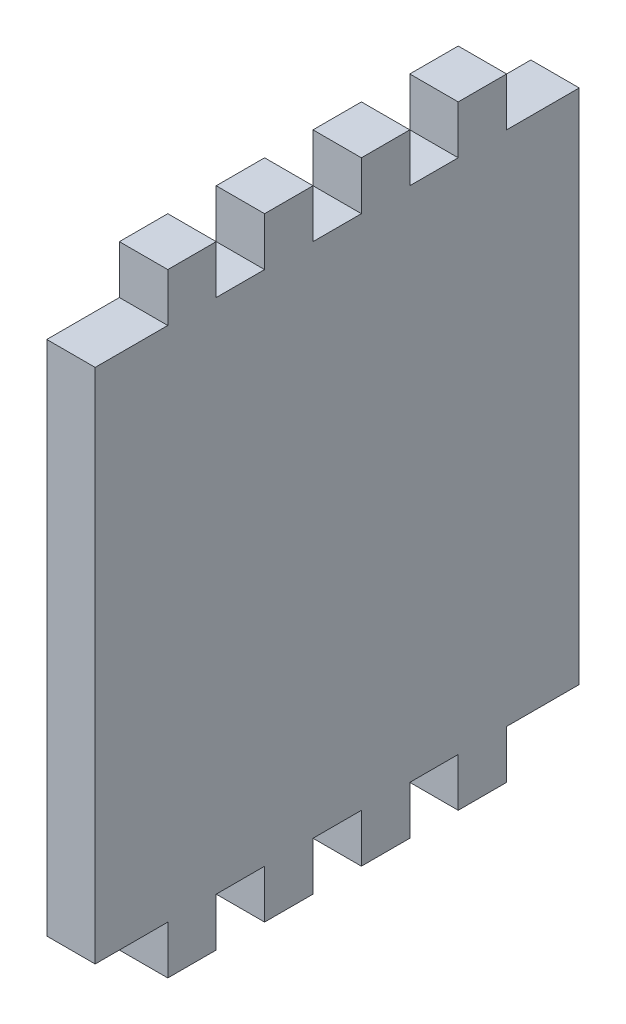
ISO-10303-21;
HEADER;
FILE_DESCRIPTION(('STEP AP214'),'2;1');
FILE_NAME('part.step','',(''),(''),'','','');
FILE_SCHEMA(('AUTOMOTIVE_DESIGN { 1 0 10303 214 1 1 1 1 }'));
ENDSEC;
DATA;
#1=APPLICATION_CONTEXT('core data for automotive mechanical design processes');
#2=APPLICATION_PROTOCOL_DEFINITION('international standard','automotive_design',2000,#1);
#3=PRODUCT_CONTEXT('',#1,'mechanical');
#4=PRODUCT('Part','Part','',(#3));
#5=PRODUCT_RELATED_PRODUCT_CATEGORY('part','',(#4));
#6=PRODUCT_DEFINITION_FORMATION('','',#4);
#7=PRODUCT_DEFINITION_CONTEXT('part definition',#1,'design');
#8=PRODUCT_DEFINITION('design','',#6,#7);
#9=PRODUCT_DEFINITION_SHAPE('','',#8);
#10=(LENGTH_UNIT() NAMED_UNIT(*) SI_UNIT(.MILLI.,.METRE.));
#11=(NAMED_UNIT(*) PLANE_ANGLE_UNIT() SI_UNIT($,.RADIAN.));
#12=(NAMED_UNIT(*) SI_UNIT($,.STERADIAN.) SOLID_ANGLE_UNIT());
#13=UNCERTAINTY_MEASURE_WITH_UNIT(LENGTH_MEASURE(1.E-05),#10,'distance_accuracy_value','');
#14=(GEOMETRIC_REPRESENTATION_CONTEXT(3) GLOBAL_UNCERTAINTY_ASSIGNED_CONTEXT((#13)) GLOBAL_UNIT_ASSIGNED_CONTEXT((#10,
#11,#12)) REPRESENTATION_CONTEXT('',''));
#15=CARTESIAN_POINT('',(0.,0.,0.));
#16=DIRECTION('',(0.,0.,1.));
#17=DIRECTION('',(1.,0.,0.));
#18=AXIS2_PLACEMENT_3D('',#15,#16,#17);
#19=CARTESIAN_POINT('',(5.08,-40.1420998104265,20.2236966824645));
#20=DIRECTION('',(0.,1.,0.));
#21=DIRECTION('',(0.,0.,1.));
#22=AXIS2_PLACEMENT_3D('',#19,#20,#21);
#23=PLANE('',#22);
#24=DIRECTION('',(0.,0.,-1.));
#25=VECTOR('',#24,1.);
#26=CARTESIAN_POINT('',(5.08,-40.1420998104265,20.2236966824645));
#27=LINE('',#26,#25);
#28=CARTESIAN_POINT('',(5.08,-40.1420998104265,-12.7963033175355));
#29=VERTEX_POINT('',#28);
#30=CARTESIAN_POINT('',(5.08,-40.1420998104265,-17.8763033175355));
#31=VERTEX_POINT('',#30);
#32=EDGE_CURVE('E48',#29,#31,#27,.T.);
#33=ORIENTED_EDGE('',*,*,#32,.F.);
#34=DIRECTION('',(1.,0.,0.));
#35=VECTOR('',#34,1.);
#36=CARTESIAN_POINT('',(0.,-40.1420998104265,-12.7963033175355));
#37=LINE('',#36,#35);
#38=CARTESIAN_POINT('',(0.,-40.1420998104265,-12.7963033175355));
#39=VERTEX_POINT('',#38);
#40=EDGE_CURVE('E300',#39,#29,#37,.T.);
#41=ORIENTED_EDGE('',*,*,#40,.F.);
#42=DIRECTION('',(0.,0.,-1.));
#43=VECTOR('',#42,1.);
#44=CARTESIAN_POINT('',(0.,-40.1420998104265,20.2236966824645));
#45=LINE('',#44,#43);
#46=CARTESIAN_POINT('',(0.,-40.1420998104265,-17.8763033175355));
#47=VERTEX_POINT('',#46);
#48=EDGE_CURVE('E520',#39,#47,#45,.T.);
#49=ORIENTED_EDGE('',*,*,#48,.T.);
#50=DIRECTION('',(1.,0.,0.));
#51=VECTOR('',#50,1.);
#52=CARTESIAN_POINT('',(0.,-40.1420998104266,-17.8763033175355));
#53=LINE('',#52,#51);
#54=EDGE_CURVE('E315',#47,#31,#53,.T.);
#55=ORIENTED_EDGE('',*,*,#54,.T.);
#56=EDGE_LOOP('',(#33,#41,#49,#55));
#57=FACE_BOUND('',#56,.T.);
#58=ADVANCED_FACE('F33',(#57),#23,.F.);
#59=CARTESIAN_POINT('',(5.08,-40.1420998104265,-22.9563033175355));
#60=VERTEX_POINT('',#59);
#61=CARTESIAN_POINT('',(5.08,-40.1420998104265,-30.5763033175355));
#62=VERTEX_POINT('',#61);
#63=EDGE_CURVE('E496',#60,#62,#27,.T.);
#64=ORIENTED_EDGE('',*,*,#63,.F.);
#65=DIRECTION('',(1.,0.,0.));
#66=VECTOR('',#65,1.);
#67=CARTESIAN_POINT('',(0.,-40.1420998104266,-22.9563033175355));
#68=LINE('',#67,#66);
#69=CARTESIAN_POINT('',(0.,-40.1420998104266,-22.9563033175355));
#70=VERTEX_POINT('',#69);
#71=EDGE_CURVE('E323',#70,#60,#68,.T.);
#72=ORIENTED_EDGE('',*,*,#71,.F.);
#73=CARTESIAN_POINT('',(0.,-40.1420998104265,-30.5763033175355));
#74=VERTEX_POINT('',#73);
#75=EDGE_CURVE('E515',#70,#74,#45,.T.);
#76=ORIENTED_EDGE('',*,*,#75,.T.);
#77=DIRECTION('',(-1.,0.,0.));
#78=VECTOR('',#77,1.);
#79=CARTESIAN_POINT('',(5.08,-40.1420998104265,-30.5763033175355));
#80=LINE('',#79,#78);
#81=EDGE_CURVE('E41',#62,#74,#80,.T.);
#82=ORIENTED_EDGE('',*,*,#81,.F.);
#83=EDGE_LOOP('',(#64,#72,#76,#82));
#84=FACE_BOUND('',#83,.T.);
#85=ADVANCED_FACE('F627',(#84),#23,.F.);
#86=CARTESIAN_POINT('',(5.08,-40.1420998104265,7.5236966824645));
#87=VERTEX_POINT('',#86);
#88=CARTESIAN_POINT('',(5.08,-40.1420998104265,2.4436966824645));
#89=VERTEX_POINT('',#88);
#90=EDGE_CURVE('E502',#87,#89,#27,.T.);
#91=ORIENTED_EDGE('',*,*,#90,.F.);
#92=DIRECTION('',(1.,0.,0.));
#93=VECTOR('',#92,1.);
#94=CARTESIAN_POINT('',(0.,-40.1420998104265,7.5236966824645));
#95=LINE('',#94,#93);
#96=CARTESIAN_POINT('',(0.,-40.1420998104265,7.5236966824645));
#97=VERTEX_POINT('',#96);
#98=EDGE_CURVE('E342',#97,#87,#95,.T.);
#99=ORIENTED_EDGE('',*,*,#98,.F.);
#100=CARTESIAN_POINT('',(0.,-40.1420998104265,2.4436966824645));
#101=VERTEX_POINT('',#100);
#102=EDGE_CURVE('E519',#97,#101,#45,.T.);
#103=ORIENTED_EDGE('',*,*,#102,.T.);
#104=DIRECTION('',(1.,0.,0.));
#105=VECTOR('',#104,1.);
#106=CARTESIAN_POINT('',(0.,-40.1420998104265,2.4436966824645));
#107=LINE('',#106,#105);
#108=EDGE_CURVE('E381',#101,#89,#107,.T.);
#109=ORIENTED_EDGE('',*,*,#108,.T.);
#110=EDGE_LOOP('',(#91,#99,#103,#109));
#111=FACE_BOUND('',#110,.T.);
#112=ADVANCED_FACE('F612',(#111),#23,.F.);
#113=CARTESIAN_POINT('',(0.,-40.1420998104265,-2.6363033175355));
#114=VERTEX_POINT('',#113);
#115=CARTESIAN_POINT('',(0.,-40.1420998104265,-7.71630331753551));
#116=VERTEX_POINT('',#115);
#117=EDGE_CURVE('E521',#114,#116,#45,.T.);
#118=ORIENTED_EDGE('',*,*,#117,.T.);
#119=DIRECTION('',(1.,0.,0.));
#120=VECTOR('',#119,1.);
#121=CARTESIAN_POINT('',(0.,-40.1420998104265,-7.71630331753551));
#122=LINE('',#121,#120);
#123=CARTESIAN_POINT('',(5.08,-40.1420998104265,-7.71630331753551));
#124=VERTEX_POINT('',#123);
#125=EDGE_CURVE('E56',#116,#124,#122,.T.);
#126=ORIENTED_EDGE('',*,*,#125,.T.);
#127=CARTESIAN_POINT('',(5.08,-40.1420998104265,-2.6363033175355));
#128=VERTEX_POINT('',#127);
#129=EDGE_CURVE('E503',#128,#124,#27,.T.);
#130=ORIENTED_EDGE('',*,*,#129,.F.);
#131=DIRECTION('',(1.,0.,0.));
#132=VECTOR('',#131,1.);
#133=CARTESIAN_POINT('',(0.,-40.1420998104265,-2.6363033175355));
#134=LINE('',#133,#132);
#135=EDGE_CURVE('E368',#114,#128,#134,.T.);
#136=ORIENTED_EDGE('',*,*,#135,.F.);
#137=EDGE_LOOP('',(#118,#126,#130,#136));
#138=FACE_BOUND('',#137,.T.);
#139=ADVANCED_FACE('F629',(#138),#23,.F.);
#140=CARTESIAN_POINT('',(5.08,14.0843601895735,20.2236966824645));
#141=DIRECTION('',(0.,-1.,0.));
#142=DIRECTION('',(0.,0.,-1.));
#143=AXIS2_PLACEMENT_3D('',#140,#141,#142);
#144=PLANE('',#143);
#145=DIRECTION('',(0.,0.,1.));
#146=VECTOR('',#145,1.);
#147=CARTESIAN_POINT('',(5.08,14.0843601895735,20.2236966824645));
#148=LINE('',#147,#146);
#149=CARTESIAN_POINT('',(5.08,14.0843601895735,2.44369668246448));
#150=VERTEX_POINT('',#149);
#151=CARTESIAN_POINT('',(5.08,14.0843601895735,7.52369668246448));
#152=VERTEX_POINT('',#151);
#153=EDGE_CURVE('E511',#150,#152,#148,.T.);
#154=ORIENTED_EDGE('',*,*,#153,.F.);
#155=DIRECTION('',(1.,0.,0.));
#156=VECTOR('',#155,1.);
#157=CARTESIAN_POINT('',(0.,14.0843601895735,2.44369668246448));
#158=LINE('',#157,#156);
#159=CARTESIAN_POINT('',(0.,14.0843601895735,2.44369668246448));
#160=VERTEX_POINT('',#159);
#161=EDGE_CURVE('E403',#160,#150,#158,.T.);
#162=ORIENTED_EDGE('',*,*,#161,.F.);
#163=DIRECTION('',(0.,0.,1.));
#164=VECTOR('',#163,1.);
#165=CARTESIAN_POINT('',(0.,14.0843601895735,20.2236966824645));
#166=LINE('',#165,#164);
#167=CARTESIAN_POINT('',(0.,14.0843601895735,7.52369668246448));
#168=VERTEX_POINT('',#167);
#169=EDGE_CURVE('E526',#160,#168,#166,.T.);
#170=ORIENTED_EDGE('',*,*,#169,.T.);
#171=DIRECTION('',(1.,0.,0.));
#172=VECTOR('',#171,1.);
#173=CARTESIAN_POINT('',(0.,14.0843601895735,7.52369668246448));
#174=LINE('',#173,#172);
#175=EDGE_CURVE('E422',#168,#152,#174,.T.);
#176=ORIENTED_EDGE('',*,*,#175,.T.);
#177=EDGE_LOOP('',(#154,#162,#170,#176));
#178=FACE_BOUND('',#177,.T.);
#179=ADVANCED_FACE('F576',(#178),#144,.F.);
#180=CARTESIAN_POINT('',(5.08,14.0843601895735,12.6036966824645));
#181=VERTEX_POINT('',#180);
#182=CARTESIAN_POINT('',(5.08,14.0843601895735,20.2236966824645));
#183=VERTEX_POINT('',#182);
#184=EDGE_CURVE('E505',#181,#183,#148,.T.);
#185=ORIENTED_EDGE('',*,*,#184,.F.);
#186=DIRECTION('',(1.,0.,0.));
#187=VECTOR('',#186,1.);
#188=CARTESIAN_POINT('',(0.,14.0843601895735,12.6036966824645));
#189=LINE('',#188,#187);
#190=CARTESIAN_POINT('',(0.,14.0843601895735,12.6036966824645));
#191=VERTEX_POINT('',#190);
#192=EDGE_CURVE('E430',#191,#181,#189,.T.);
#193=ORIENTED_EDGE('',*,*,#192,.F.);
#194=CARTESIAN_POINT('',(0.,14.0843601895735,20.2236966824645));
#195=VERTEX_POINT('',#194);
#196=EDGE_CURVE('E523',#191,#195,#166,.T.);
#197=ORIENTED_EDGE('',*,*,#196,.T.);
#198=DIRECTION('',(-1.,0.,0.));
#199=VECTOR('',#198,1.);
#200=CARTESIAN_POINT('',(5.08,14.0843601895735,20.2236966824645));
#201=LINE('',#200,#199);
#202=EDGE_CURVE('E509',#183,#195,#201,.T.);
#203=ORIENTED_EDGE('',*,*,#202,.F.);
#204=EDGE_LOOP('',(#185,#193,#197,#203));
#205=FACE_BOUND('',#204,.T.);
#206=ADVANCED_FACE('F592',(#205),#144,.F.);
#207=CARTESIAN_POINT('',(5.08,14.0843601895735,-17.8763033175355));
#208=VERTEX_POINT('',#207);
#209=CARTESIAN_POINT('',(5.08,14.0843601895735,-12.7963033175355));
#210=VERTEX_POINT('',#209);
#211=EDGE_CURVE('E510',#208,#210,#148,.T.);
#212=ORIENTED_EDGE('',*,*,#211,.F.);
#213=DIRECTION('',(1.,0.,0.));
#214=VECTOR('',#213,1.);
#215=CARTESIAN_POINT('',(0.,14.0843601895735,-17.8763033175355));
#216=LINE('',#215,#214);
#217=CARTESIAN_POINT('',(0.,14.0843601895735,-17.8763033175355));
#218=VERTEX_POINT('',#217);
#219=EDGE_CURVE('E450',#218,#208,#216,.T.);
#220=ORIENTED_EDGE('',*,*,#219,.F.);
#221=CARTESIAN_POINT('',(0.,14.0843601895735,-12.7963033175355));
#222=VERTEX_POINT('',#221);
#223=EDGE_CURVE('E525',#218,#222,#166,.T.);
#224=ORIENTED_EDGE('',*,*,#223,.T.);
#225=DIRECTION('',(1.,0.,0.));
#226=VECTOR('',#225,1.);
#227=CARTESIAN_POINT('',(0.,14.0843601895735,-12.7963033175355));
#228=LINE('',#227,#226);
#229=EDGE_CURVE('E489',#222,#210,#228,.T.);
#230=ORIENTED_EDGE('',*,*,#229,.T.);
#231=EDGE_LOOP('',(#212,#220,#224,#230));
#232=FACE_BOUND('',#231,.T.);
#233=ADVANCED_FACE('F569',(#232),#144,.F.);
#234=CARTESIAN_POINT('',(0.,14.0843601895735,-7.71630331753552));
#235=VERTEX_POINT('',#234);
#236=CARTESIAN_POINT('',(0.,14.0843601895735,-2.63630331753552));
#237=VERTEX_POINT('',#236);
#238=EDGE_CURVE('E527',#235,#237,#166,.T.);
#239=ORIENTED_EDGE('',*,*,#238,.T.);
#240=DIRECTION('',(1.,0.,0.));
#241=VECTOR('',#240,1.);
#242=CARTESIAN_POINT('',(0.,14.0843601895735,-2.63630331753552));
#243=LINE('',#242,#241);
#244=CARTESIAN_POINT('',(5.08,14.0843601895735,-2.63630331753552));
#245=VERTEX_POINT('',#244);
#246=EDGE_CURVE('E395',#237,#245,#243,.T.);
#247=ORIENTED_EDGE('',*,*,#246,.T.);
#248=CARTESIAN_POINT('',(5.08,14.0843601895735,-7.71630331753552));
#249=VERTEX_POINT('',#248);
#250=EDGE_CURVE('E512',#249,#245,#148,.T.);
#251=ORIENTED_EDGE('',*,*,#250,.F.);
#252=DIRECTION('',(1.,0.,0.));
#253=VECTOR('',#252,1.);
#254=CARTESIAN_POINT('',(0.,14.0843601895735,-7.71630331753552));
#255=LINE('',#254,#253);
#256=EDGE_CURVE('E476',#235,#249,#255,.T.);
#257=ORIENTED_EDGE('',*,*,#256,.F.);
#258=EDGE_LOOP('',(#239,#247,#251,#257));
#259=FACE_BOUND('',#258,.T.);
#260=ADVANCED_FACE('F661',(#259),#144,.F.);
#261=CARTESIAN_POINT('',(5.08,14.0843601895735,20.2236966824645));
#262=DIRECTION('',(0.,0.,-1.));
#263=DIRECTION('',(0.,1.,0.));
#264=AXIS2_PLACEMENT_3D('',#261,#262,#263);
#265=PLANE('',#264);
#266=DIRECTION('',(0.,-1.,0.));
#267=VECTOR('',#266,1.);
#268=CARTESIAN_POINT('',(0.,14.0843601895735,20.2236966824645));
#269=LINE('',#268,#267);
#270=CARTESIAN_POINT('',(0.,-40.1420998104265,20.2236966824645));
#271=VERTEX_POINT('',#270);
#272=EDGE_CURVE('E486',#195,#271,#269,.T.);
#273=ORIENTED_EDGE('',*,*,#272,.T.);
#274=DIRECTION('',(-1.,0.,0.));
#275=VECTOR('',#274,1.);
#276=CARTESIAN_POINT('',(5.08,-40.1420998104265,20.2236966824645));
#277=LINE('',#276,#275);
#278=CARTESIAN_POINT('',(5.08,-40.1420998104265,20.2236966824645));
#279=VERTEX_POINT('',#278);
#280=EDGE_CURVE('E11',#279,#271,#277,.T.);
#281=ORIENTED_EDGE('',*,*,#280,.F.);
#282=DIRECTION('',(0.,-1.,0.));
#283=VECTOR('',#282,1.);
#284=CARTESIAN_POINT('',(5.08,14.0843601895735,20.2236966824645));
#285=LINE('',#284,#283);
#286=EDGE_CURVE('E493',#183,#279,#285,.T.);
#287=ORIENTED_EDGE('',*,*,#286,.F.);
#288=ORIENTED_EDGE('',*,*,#202,.T.);
#289=EDGE_LOOP('',(#273,#281,#287,#288));
#290=FACE_BOUND('',#289,.T.);
#291=ADVANCED_FACE('F35',(#290),#265,.F.);
#292=CARTESIAN_POINT('',(0.,-40.1420998104265,12.6036966824645));
#293=VERTEX_POINT('',#292);
#294=EDGE_CURVE('E516',#271,#293,#45,.T.);
#295=ORIENTED_EDGE('',*,*,#294,.T.);
#296=DIRECTION('',(1.,0.,0.));
#297=VECTOR('',#296,1.);
#298=CARTESIAN_POINT('',(0.,-40.1420998104265,12.6036966824645));
#299=LINE('',#298,#297);
#300=CARTESIAN_POINT('',(5.08,-40.1420998104265,12.6036966824645));
#301=VERTEX_POINT('',#300);
#302=EDGE_CURVE('E355',#293,#301,#299,.T.);
#303=ORIENTED_EDGE('',*,*,#302,.T.);
#304=EDGE_CURVE('E498',#279,#301,#27,.T.);
#305=ORIENTED_EDGE('',*,*,#304,.F.);
#306=ORIENTED_EDGE('',*,*,#280,.T.);
#307=EDGE_LOOP('',(#295,#303,#305,#306));
#308=FACE_BOUND('',#307,.T.);
#309=ADVANCED_FACE('F595',(#308),#23,.F.);
#310=CARTESIAN_POINT('',(5.08,14.0843601895735,-30.5763033175355));
#311=DIRECTION('',(0.,0.,1.));
#312=DIRECTION('',(0.,-1.,0.));
#313=AXIS2_PLACEMENT_3D('',#310,#311,#312);
#314=PLANE('',#313);
#315=DIRECTION('',(0.,1.,0.));
#316=VECTOR('',#315,1.);
#317=CARTESIAN_POINT('',(0.,14.0843601895735,-30.5763033175355));
#318=LINE('',#317,#316);
#319=CARTESIAN_POINT('',(0.,14.0843601895735,-30.5763033175355));
#320=VERTEX_POINT('',#319);
#321=EDGE_CURVE('E518',#74,#320,#318,.T.);
#322=ORIENTED_EDGE('',*,*,#321,.T.);
#323=DIRECTION('',(-1.,0.,0.));
#324=VECTOR('',#323,1.);
#325=CARTESIAN_POINT('',(5.08,14.0843601895735,-30.5763033175355));
#326=LINE('',#325,#324);
#327=CARTESIAN_POINT('',(5.08,14.0843601895735,-30.5763033175355));
#328=VERTEX_POINT('',#327);
#329=EDGE_CURVE('E530',#328,#320,#326,.T.);
#330=ORIENTED_EDGE('',*,*,#329,.F.);
#331=DIRECTION('',(0.,1.,0.));
#332=VECTOR('',#331,1.);
#333=CARTESIAN_POINT('',(5.08,14.0843601895735,-30.5763033175355));
#334=LINE('',#333,#332);
#335=EDGE_CURVE('E501',#62,#328,#334,.T.);
#336=ORIENTED_EDGE('',*,*,#335,.F.);
#337=ORIENTED_EDGE('',*,*,#81,.T.);
#338=EDGE_LOOP('',(#322,#330,#336,#337));
#339=FACE_BOUND('',#338,.T.);
#340=ADVANCED_FACE('F537',(#339),#314,.F.);
#341=CARTESIAN_POINT('',(0.,14.0843601895735,-22.9563033175355));
#342=VERTEX_POINT('',#341);
#343=EDGE_CURVE('E497',#320,#342,#166,.T.);
#344=ORIENTED_EDGE('',*,*,#343,.T.);
#345=DIRECTION('',(1.,0.,0.));
#346=VECTOR('',#345,1.);
#347=CARTESIAN_POINT('',(0.,14.0843601895735,-22.9563033175355));
#348=LINE('',#347,#346);
#349=CARTESIAN_POINT('',(5.08,14.0843601895735,-22.9563033175355));
#350=VERTEX_POINT('',#349);
#351=EDGE_CURVE('E463',#342,#350,#348,.T.);
#352=ORIENTED_EDGE('',*,*,#351,.T.);
#353=EDGE_CURVE('E506',#328,#350,#148,.T.);
#354=ORIENTED_EDGE('',*,*,#353,.F.);
#355=ORIENTED_EDGE('',*,*,#329,.T.);
#356=EDGE_LOOP('',(#344,#352,#354,#355));
#357=FACE_BOUND('',#356,.T.);
#358=ADVANCED_FACE('F547',(#357),#144,.F.);
#359=CARTESIAN_POINT('',(5.08,0.,0.));
#360=DIRECTION('',(1.,0.,0.));
#361=DIRECTION('',(0.,0.,-1.));
#362=AXIS2_PLACEMENT_3D('',#359,#360,#361);
#363=PLANE('',#362);
#364=ORIENTED_EDGE('',*,*,#286,.T.);
#365=ORIENTED_EDGE('',*,*,#304,.T.);
#366=DIRECTION('',(0.,-1.,0.));
#367=VECTOR('',#366,1.);
#368=CARTESIAN_POINT('',(5.08,-40.1420998104265,12.6036966824645));
#369=LINE('',#368,#367);
#370=CARTESIAN_POINT('',(5.08,-45.2220998104265,12.6036966824645));
#371=VERTEX_POINT('',#370);
#372=EDGE_CURVE('E345',#301,#371,#369,.T.);
#373=ORIENTED_EDGE('',*,*,#372,.T.);
#374=DIRECTION('',(0.,0.,-1.));
#375=VECTOR('',#374,1.);
#376=CARTESIAN_POINT('',(5.08,-45.2220998104265,7.5236966824645));
#377=LINE('',#376,#375);
#378=CARTESIAN_POINT('',(5.08,-45.2220998104265,7.5236966824645));
#379=VERTEX_POINT('',#378);
#380=EDGE_CURVE('E336',#371,#379,#377,.T.);
#381=ORIENTED_EDGE('',*,*,#380,.T.);
#382=DIRECTION('',(0.,1.,0.));
#383=VECTOR('',#382,1.);
#384=CARTESIAN_POINT('',(5.08,-40.1420998104265,7.5236966824645));
#385=LINE('',#384,#383);
#386=EDGE_CURVE('E326',#379,#87,#385,.T.);
#387=ORIENTED_EDGE('',*,*,#386,.T.);
#388=ORIENTED_EDGE('',*,*,#90,.T.);
#389=DIRECTION('',(0.,-1.,0.));
#390=VECTOR('',#389,1.);
#391=CARTESIAN_POINT('',(5.08,-40.1420998104265,2.4436966824645));
#392=LINE('',#391,#390);
#393=CARTESIAN_POINT('',(5.08,-45.2220998104265,2.4436966824645));
#394=VERTEX_POINT('',#393);
#395=EDGE_CURVE('E371',#89,#394,#392,.T.);
#396=ORIENTED_EDGE('',*,*,#395,.T.);
#397=DIRECTION('',(0.,0.,-1.));
#398=VECTOR('',#397,1.);
#399=CARTESIAN_POINT('',(5.08,-45.2220998104265,-2.6363033175355));
#400=LINE('',#399,#398);
#401=CARTESIAN_POINT('',(5.08,-45.2220998104265,-2.6363033175355));
#402=VERTEX_POINT('',#401);
#403=EDGE_CURVE('E362',#394,#402,#400,.T.);
#404=ORIENTED_EDGE('',*,*,#403,.T.);
#405=DIRECTION('',(0.,1.,0.));
#406=VECTOR('',#405,1.);
#407=CARTESIAN_POINT('',(5.08,-40.1420998104265,-2.6363033175355));
#408=LINE('',#407,#406);
#409=EDGE_CURVE('E352',#402,#128,#408,.T.);
#410=ORIENTED_EDGE('',*,*,#409,.T.);
#411=ORIENTED_EDGE('',*,*,#129,.T.);
#412=DIRECTION('',(0.,-1.,0.));
#413=VECTOR('',#412,1.);
#414=CARTESIAN_POINT('',(5.08,-40.1420998104265,-7.71630331753551));
#415=LINE('',#414,#413);
#416=CARTESIAN_POINT('',(5.08,-45.2220998104265,-7.71630331753551));
#417=VERTEX_POINT('',#416);
#418=EDGE_CURVE('E297',#124,#417,#415,.T.);
#419=ORIENTED_EDGE('',*,*,#418,.T.);
#420=DIRECTION('',(0.,0.,-1.));
#421=VECTOR('',#420,1.);
#422=CARTESIAN_POINT('',(5.08,-45.2220998104265,-7.71630331753551));
#423=LINE('',#422,#421);
#424=CARTESIAN_POINT('',(5.08,-45.2220998104265,-12.7963033175355));
#425=VERTEX_POINT('',#424);
#426=EDGE_CURVE('E274',#417,#425,#423,.T.);
#427=ORIENTED_EDGE('',*,*,#426,.T.);
#428=DIRECTION('',(0.,1.,0.));
#429=VECTOR('',#428,1.);
#430=CARTESIAN_POINT('',(5.08,-40.1420998104265,-12.7963033175355));
#431=LINE('',#430,#429);
#432=EDGE_CURVE('E291',#425,#29,#431,.T.);
#433=ORIENTED_EDGE('',*,*,#432,.T.);
#434=ORIENTED_EDGE('',*,*,#32,.T.);
#435=DIRECTION('',(0.,-1.,0.));
#436=VECTOR('',#435,1.);
#437=CARTESIAN_POINT('',(5.08,-40.1420998104266,-17.8763033175355));
#438=LINE('',#437,#436);
#439=CARTESIAN_POINT('',(5.08,-45.2220998104265,-17.8763033175355));
#440=VERTEX_POINT('',#439);
#441=EDGE_CURVE('E302',#31,#440,#438,.T.);
#442=ORIENTED_EDGE('',*,*,#441,.T.);
#443=DIRECTION('',(0.,0.,-1.));
#444=VECTOR('',#443,1.);
#445=CARTESIAN_POINT('',(5.08,-45.2220998104265,-17.8763033175355));
#446=LINE('',#445,#444);
#447=CARTESIAN_POINT('',(5.08,-45.2220998104265,-22.9563033175355));
#448=VERTEX_POINT('',#447);
#449=EDGE_CURVE('E318',#440,#448,#446,.T.);
#450=ORIENTED_EDGE('',*,*,#449,.T.);
#451=DIRECTION('',(0.,1.,0.));
#452=VECTOR('',#451,1.);
#453=CARTESIAN_POINT('',(5.08,-40.1420998104266,-22.9563033175355));
#454=LINE('',#453,#452);
#455=EDGE_CURVE('E309',#448,#60,#454,.T.);
#456=ORIENTED_EDGE('',*,*,#455,.T.);
#457=ORIENTED_EDGE('',*,*,#63,.T.);
#458=ORIENTED_EDGE('',*,*,#335,.T.);
#459=ORIENTED_EDGE('',*,*,#353,.T.);
#460=DIRECTION('',(0.,1.,0.));
#461=VECTOR('',#460,1.);
#462=CARTESIAN_POINT('',(5.08,14.0843601895735,-22.9563033175355));
#463=LINE('',#462,#461);
#464=CARTESIAN_POINT('',(5.08,19.1643601895735,-22.9563033175355));
#465=VERTEX_POINT('',#464);
#466=EDGE_CURVE('E453',#350,#465,#463,.T.);
#467=ORIENTED_EDGE('',*,*,#466,.T.);
#468=DIRECTION('',(0.,0.,1.));
#469=VECTOR('',#468,1.);
#470=CARTESIAN_POINT('',(5.08,19.1643601895735,-17.8763033175355));
#471=LINE('',#470,#469);
#472=CARTESIAN_POINT('',(5.08,19.1643601895735,-17.8763033175355));
#473=VERTEX_POINT('',#472);
#474=EDGE_CURVE('E444',#465,#473,#471,.T.);
#475=ORIENTED_EDGE('',*,*,#474,.T.);
#476=DIRECTION('',(0.,-1.,0.));
#477=VECTOR('',#476,1.);
#478=CARTESIAN_POINT('',(5.08,14.0843601895735,-17.8763033175355));
#479=LINE('',#478,#477);
#480=EDGE_CURVE('E433',#473,#208,#479,.T.);
#481=ORIENTED_EDGE('',*,*,#480,.T.);
#482=ORIENTED_EDGE('',*,*,#211,.T.);
#483=DIRECTION('',(0.,1.,0.));
#484=VECTOR('',#483,1.);
#485=CARTESIAN_POINT('',(5.08,14.0843601895735,-12.7963033175355));
#486=LINE('',#485,#484);
#487=CARTESIAN_POINT('',(5.08,19.1643601895735,-12.7963033175355));
#488=VERTEX_POINT('',#487);
#489=EDGE_CURVE('E479',#210,#488,#486,.T.);
#490=ORIENTED_EDGE('',*,*,#489,.T.);
#491=DIRECTION('',(0.,0.,1.));
#492=VECTOR('',#491,1.);
#493=CARTESIAN_POINT('',(5.08,19.1643601895735,-7.71630331753552));
#494=LINE('',#493,#492);
#495=CARTESIAN_POINT('',(5.08,19.1643601895735,-7.71630331753552));
#496=VERTEX_POINT('',#495);
#497=EDGE_CURVE('E470',#488,#496,#494,.T.);
#498=ORIENTED_EDGE('',*,*,#497,.T.);
#499=DIRECTION('',(0.,-1.,0.));
#500=VECTOR('',#499,1.);
#501=CARTESIAN_POINT('',(5.08,14.0843601895735,-7.71630331753552));
#502=LINE('',#501,#500);
#503=EDGE_CURVE('E460',#496,#249,#502,.T.);
#504=ORIENTED_EDGE('',*,*,#503,.T.);
#505=ORIENTED_EDGE('',*,*,#250,.T.);
#506=DIRECTION('',(0.,1.,0.));
#507=VECTOR('',#506,1.);
#508=CARTESIAN_POINT('',(5.08,14.0843601895735,-2.63630331753552));
#509=LINE('',#508,#507);
#510=CARTESIAN_POINT('',(5.08,19.1643601895735,-2.63630331753552));
#511=VERTEX_POINT('',#510);
#512=EDGE_CURVE('E378',#245,#511,#509,.T.);
#513=ORIENTED_EDGE('',*,*,#512,.T.);
#514=DIRECTION('',(0.,0.,1.));
#515=VECTOR('',#514,1.);
#516=CARTESIAN_POINT('',(5.08,19.1643601895735,-2.63630331753552));
#517=LINE('',#516,#515);
#518=CARTESIAN_POINT('',(5.08,19.1643601895735,2.44369668246448));
#519=VERTEX_POINT('',#518);
#520=EDGE_CURVE('E398',#511,#519,#517,.T.);
#521=ORIENTED_EDGE('',*,*,#520,.T.);
#522=DIRECTION('',(0.,-1.,0.));
#523=VECTOR('',#522,1.);
#524=CARTESIAN_POINT('',(5.08,14.0843601895735,2.44369668246448));
#525=LINE('',#524,#523);
#526=EDGE_CURVE('E389',#519,#150,#525,.T.);
#527=ORIENTED_EDGE('',*,*,#526,.T.);
#528=ORIENTED_EDGE('',*,*,#153,.T.);
#529=DIRECTION('',(0.,1.,0.));
#530=VECTOR('',#529,1.);
#531=CARTESIAN_POINT('',(5.08,14.0843601895735,7.52369668246448));
#532=LINE('',#531,#530);
#533=CARTESIAN_POINT('',(5.08,19.1643601895735,7.52369668246448));
#534=VERTEX_POINT('',#533);
#535=EDGE_CURVE('E406',#152,#534,#532,.T.);
#536=ORIENTED_EDGE('',*,*,#535,.T.);
#537=DIRECTION('',(0.,0.,1.));
#538=VECTOR('',#537,1.);
#539=CARTESIAN_POINT('',(5.08,19.1643601895735,7.52369668246448));
#540=LINE('',#539,#538);
#541=CARTESIAN_POINT('',(5.08,19.1643601895735,12.6036966824645));
#542=VERTEX_POINT('',#541);
#543=EDGE_CURVE('E425',#534,#542,#540,.T.);
#544=ORIENTED_EDGE('',*,*,#543,.T.);
#545=DIRECTION('',(0.,-1.,0.));
#546=VECTOR('',#545,1.);
#547=CARTESIAN_POINT('',(5.08,14.0843601895735,12.6036966824645));
#548=LINE('',#547,#546);
#549=EDGE_CURVE('E416',#542,#181,#548,.T.);
#550=ORIENTED_EDGE('',*,*,#549,.T.);
#551=ORIENTED_EDGE('',*,*,#184,.T.);
#552=EDGE_LOOP('',(#364,#365,#373,#381,#387,#388,#396,#404,#410,#411,#419,#427,#433,#434,#442,
#450,#456,#457,#458,#459,#467,#475,#481,#482,#490,#498,#504,#505,#513,#521,#527,#528,#536,#544,
#550,#551));
#553=FACE_BOUND('',#552,.T.);
#554=ADVANCED_FACE('F554',(#553),#363,.T.);
#555=CARTESIAN_POINT('',(0.,0.,0.));
#556=DIRECTION('',(1.,0.,0.));
#557=DIRECTION('',(0.,0.,-1.));
#558=AXIS2_PLACEMENT_3D('',#555,#556,#557);
#559=PLANE('',#558);
#560=ORIENTED_EDGE('',*,*,#272,.F.);
#561=ORIENTED_EDGE('',*,*,#196,.F.);
#562=DIRECTION('',(0.,-1.,0.));
#563=VECTOR('',#562,1.);
#564=CARTESIAN_POINT('',(0.,14.0843601895735,12.6036966824645));
#565=LINE('',#564,#563);
#566=CARTESIAN_POINT('',(0.,19.1643601895735,12.6036966824645));
#567=VERTEX_POINT('',#566);
#568=EDGE_CURVE('E419',#567,#191,#565,.T.);
#569=ORIENTED_EDGE('',*,*,#568,.F.);
#570=DIRECTION('',(0.,0.,1.));
#571=VECTOR('',#570,1.);
#572=CARTESIAN_POINT('',(0.,19.1643601895735,7.52369668246448));
#573=LINE('',#572,#571);
#574=CARTESIAN_POINT('',(0.,19.1643601895735,7.52369668246448));
#575=VERTEX_POINT('',#574);
#576=EDGE_CURVE('E415',#575,#567,#573,.T.);
#577=ORIENTED_EDGE('',*,*,#576,.F.);
#578=DIRECTION('',(0.,1.,0.));
#579=VECTOR('',#578,1.);
#580=CARTESIAN_POINT('',(0.,14.0843601895735,7.52369668246448));
#581=LINE('',#580,#579);
#582=EDGE_CURVE('E412',#168,#575,#581,.T.);
#583=ORIENTED_EDGE('',*,*,#582,.F.);
#584=ORIENTED_EDGE('',*,*,#169,.F.);
#585=DIRECTION('',(0.,-1.,0.));
#586=VECTOR('',#585,1.);
#587=CARTESIAN_POINT('',(0.,14.0843601895735,2.44369668246448));
#588=LINE('',#587,#586);
#589=CARTESIAN_POINT('',(0.,19.1643601895735,2.44369668246448));
#590=VERTEX_POINT('',#589);
#591=EDGE_CURVE('E392',#590,#160,#588,.T.);
#592=ORIENTED_EDGE('',*,*,#591,.F.);
#593=DIRECTION('',(0.,0.,1.));
#594=VECTOR('',#593,1.);
#595=CARTESIAN_POINT('',(0.,19.1643601895735,-2.63630331753552));
#596=LINE('',#595,#594);
#597=CARTESIAN_POINT('',(0.,19.1643601895735,-2.63630331753552));
#598=VERTEX_POINT('',#597);
#599=EDGE_CURVE('E388',#598,#590,#596,.T.);
#600=ORIENTED_EDGE('',*,*,#599,.F.);
#601=DIRECTION('',(0.,1.,0.));
#602=VECTOR('',#601,1.);
#603=CARTESIAN_POINT('',(0.,14.0843601895735,-2.63630331753552));
#604=LINE('',#603,#602);
#605=EDGE_CURVE('E385',#237,#598,#604,.T.);
#606=ORIENTED_EDGE('',*,*,#605,.F.);
#607=ORIENTED_EDGE('',*,*,#238,.F.);
#608=DIRECTION('',(0.,-1.,0.));
#609=VECTOR('',#608,1.);
#610=CARTESIAN_POINT('',(0.,14.0843601895735,-7.71630331753552));
#611=LINE('',#610,#609);
#612=CARTESIAN_POINT('',(0.,19.1643601895735,-7.71630331753552));
#613=VERTEX_POINT('',#612);
#614=EDGE_CURVE('E467',#613,#235,#611,.T.);
#615=ORIENTED_EDGE('',*,*,#614,.F.);
#616=DIRECTION('',(0.,0.,1.));
#617=VECTOR('',#616,1.);
#618=CARTESIAN_POINT('',(0.,19.1643601895735,-7.71630331753552));
#619=LINE('',#618,#617);
#620=CARTESIAN_POINT('',(0.,19.1643601895735,-12.7963033175355));
#621=VERTEX_POINT('',#620);
#622=EDGE_CURVE('E473',#621,#613,#619,.T.);
#623=ORIENTED_EDGE('',*,*,#622,.F.);
#624=DIRECTION('',(0.,1.,0.));
#625=VECTOR('',#624,1.);
#626=CARTESIAN_POINT('',(0.,14.0843601895735,-12.7963033175355));
#627=LINE('',#626,#625);
#628=EDGE_CURVE('E469',#222,#621,#627,.T.);
#629=ORIENTED_EDGE('',*,*,#628,.F.);
#630=ORIENTED_EDGE('',*,*,#223,.F.);
#631=DIRECTION('',(0.,-1.,0.));
#632=VECTOR('',#631,1.);
#633=CARTESIAN_POINT('',(0.,14.0843601895735,-17.8763033175355));
#634=LINE('',#633,#632);
#635=CARTESIAN_POINT('',(0.,19.1643601895735,-17.8763033175355));
#636=VERTEX_POINT('',#635);
#637=EDGE_CURVE('E440',#636,#218,#634,.T.);
#638=ORIENTED_EDGE('',*,*,#637,.F.);
#639=DIRECTION('',(0.,0.,1.));
#640=VECTOR('',#639,1.);
#641=CARTESIAN_POINT('',(0.,19.1643601895735,-17.8763033175355));
#642=LINE('',#641,#640);
#643=CARTESIAN_POINT('',(0.,19.1643601895735,-22.9563033175355));
#644=VERTEX_POINT('',#643);
#645=EDGE_CURVE('E447',#644,#636,#642,.T.);
#646=ORIENTED_EDGE('',*,*,#645,.F.);
#647=DIRECTION('',(0.,1.,0.));
#648=VECTOR('',#647,1.);
#649=CARTESIAN_POINT('',(0.,14.0843601895735,-22.9563033175355));
#650=LINE('',#649,#648);
#651=EDGE_CURVE('E443',#342,#644,#650,.T.);
#652=ORIENTED_EDGE('',*,*,#651,.F.);
#653=ORIENTED_EDGE('',*,*,#343,.F.);
#654=ORIENTED_EDGE('',*,*,#321,.F.);
#655=ORIENTED_EDGE('',*,*,#75,.F.);
#656=DIRECTION('',(0.,1.,0.));
#657=VECTOR('',#656,1.);
#658=CARTESIAN_POINT('',(0.,-40.1420998104266,-22.9563033175355));
#659=LINE('',#658,#657);
#660=CARTESIAN_POINT('',(0.,-45.2220998104265,-22.9563033175355));
#661=VERTEX_POINT('',#660);
#662=EDGE_CURVE('E312',#661,#70,#659,.T.);
#663=ORIENTED_EDGE('',*,*,#662,.F.);
#664=DIRECTION('',(0.,0.,-1.));
#665=VECTOR('',#664,1.);
#666=CARTESIAN_POINT('',(0.,-45.2220998104265,-17.8763033175355));
#667=LINE('',#666,#665);
#668=CARTESIAN_POINT('',(0.,-45.2220998104265,-17.8763033175355));
#669=VERTEX_POINT('',#668);
#670=EDGE_CURVE('E308',#669,#661,#667,.T.);
#671=ORIENTED_EDGE('',*,*,#670,.F.);
#672=DIRECTION('',(0.,-1.,0.));
#673=VECTOR('',#672,1.);
#674=CARTESIAN_POINT('',(0.,-40.1420998104266,-17.8763033175355));
#675=LINE('',#674,#673);
#676=EDGE_CURVE('E305',#47,#669,#675,.T.);
#677=ORIENTED_EDGE('',*,*,#676,.F.);
#678=ORIENTED_EDGE('',*,*,#48,.F.);
#679=DIRECTION('',(0.,1.,0.));
#680=VECTOR('',#679,1.);
#681=CARTESIAN_POINT('',(0.,-40.1420998104265,-12.7963033175355));
#682=LINE('',#681,#680);
#683=CARTESIAN_POINT('',(0.,-45.2220998104265,-12.7963033175355));
#684=VERTEX_POINT('',#683);
#685=EDGE_CURVE('E288',#684,#39,#682,.T.);
#686=ORIENTED_EDGE('',*,*,#685,.F.);
#687=DIRECTION('',(0.,0.,-1.));
#688=VECTOR('',#687,1.);
#689=CARTESIAN_POINT('',(0.,-45.2220998104265,-7.71630331753551));
#690=LINE('',#689,#688);
#691=CARTESIAN_POINT('',(0.,-45.2220998104265,-7.71630331753551));
#692=VERTEX_POINT('',#691);
#693=EDGE_CURVE('E271',#692,#684,#690,.T.);
#694=ORIENTED_EDGE('',*,*,#693,.F.);
#695=DIRECTION('',(0.,-1.,0.));
#696=VECTOR('',#695,1.);
#697=CARTESIAN_POINT('',(0.,-40.1420998104265,-7.71630331753551));
#698=LINE('',#697,#696);
#699=EDGE_CURVE('E286',#116,#692,#698,.T.);
#700=ORIENTED_EDGE('',*,*,#699,.F.);
#701=ORIENTED_EDGE('',*,*,#117,.F.);
#702=DIRECTION('',(0.,1.,0.));
#703=VECTOR('',#702,1.);
#704=CARTESIAN_POINT('',(0.,-40.1420998104265,-2.6363033175355));
#705=LINE('',#704,#703);
#706=CARTESIAN_POINT('',(0.,-45.2220998104265,-2.6363033175355));
#707=VERTEX_POINT('',#706);
#708=EDGE_CURVE('E359',#707,#114,#705,.T.);
#709=ORIENTED_EDGE('',*,*,#708,.F.);
#710=DIRECTION('',(0.,0.,-1.));
#711=VECTOR('',#710,1.);
#712=CARTESIAN_POINT('',(0.,-45.2220998104265,-2.6363033175355));
#713=LINE('',#712,#711);
#714=CARTESIAN_POINT('',(0.,-45.2220998104265,2.4436966824645));
#715=VERTEX_POINT('',#714);
#716=EDGE_CURVE('E365',#715,#707,#713,.T.);
#717=ORIENTED_EDGE('',*,*,#716,.F.);
#718=DIRECTION('',(0.,-1.,0.));
#719=VECTOR('',#718,1.);
#720=CARTESIAN_POINT('',(0.,-40.1420998104265,2.4436966824645));
#721=LINE('',#720,#719);
#722=EDGE_CURVE('E361',#101,#715,#721,.T.);
#723=ORIENTED_EDGE('',*,*,#722,.F.);
#724=ORIENTED_EDGE('',*,*,#102,.F.);
#725=DIRECTION('',(0.,1.,0.));
#726=VECTOR('',#725,1.);
#727=CARTESIAN_POINT('',(0.,-40.1420998104265,7.5236966824645));
#728=LINE('',#727,#726);
#729=CARTESIAN_POINT('',(0.,-45.2220998104265,7.5236966824645));
#730=VERTEX_POINT('',#729);
#731=EDGE_CURVE('E332',#730,#97,#728,.T.);
#732=ORIENTED_EDGE('',*,*,#731,.F.);
#733=DIRECTION('',(0.,0.,-1.));
#734=VECTOR('',#733,1.);
#735=CARTESIAN_POINT('',(0.,-45.2220998104265,7.5236966824645));
#736=LINE('',#735,#734);
#737=CARTESIAN_POINT('',(0.,-45.2220998104265,12.6036966824645));
#738=VERTEX_POINT('',#737);
#739=EDGE_CURVE('E339',#738,#730,#736,.T.);
#740=ORIENTED_EDGE('',*,*,#739,.F.);
#741=DIRECTION('',(0.,-1.,0.));
#742=VECTOR('',#741,1.);
#743=CARTESIAN_POINT('',(0.,-40.1420998104265,12.6036966824645));
#744=LINE('',#743,#742);
#745=EDGE_CURVE('E335',#293,#738,#744,.T.);
#746=ORIENTED_EDGE('',*,*,#745,.F.);
#747=ORIENTED_EDGE('',*,*,#294,.F.);
#748=EDGE_LOOP('',(#560,#561,#569,#577,#583,#584,#592,#600,#606,#607,#615,#623,#629,#630,#638,
#646,#652,#653,#654,#655,#663,#671,#677,#678,#686,#694,#700,#701,#709,#717,#723,#724,#732,#740,
#746,#747));
#749=FACE_BOUND('',#748,.T.);
#750=ADVANCED_FACE('F284',(#749),#559,.F.);
#751=CARTESIAN_POINT('',(0.,14.0843601895735,-7.71630331753552));
#752=DIRECTION('',(0.,0.,1.));
#753=DIRECTION('',(1.,0.,0.));
#754=AXIS2_PLACEMENT_3D('',#751,#752,#753);
#755=PLANE('',#754);
#756=ORIENTED_EDGE('',*,*,#503,.F.);
#757=DIRECTION('',(1.,0.,0.));
#758=VECTOR('',#757,1.);
#759=CARTESIAN_POINT('',(0.,19.1643601895735,-7.71630331753552));
#760=LINE('',#759,#758);
#761=EDGE_CURVE('E484',#613,#496,#760,.T.);
#762=ORIENTED_EDGE('',*,*,#761,.F.);
#763=ORIENTED_EDGE('',*,*,#614,.T.);
#764=ORIENTED_EDGE('',*,*,#256,.T.);
#765=EDGE_LOOP('',(#756,#762,#763,#764));
#766=FACE_BOUND('',#765,.T.);
#767=ADVANCED_FACE('F738',(#766),#755,.T.);
#768=CARTESIAN_POINT('',(0.,19.1643601895735,-7.71630331753552));
#769=DIRECTION('',(0.,1.,0.));
#770=DIRECTION('',(0.,0.,1.));
#771=AXIS2_PLACEMENT_3D('',#768,#769,#770);
#772=PLANE('',#771);
#773=ORIENTED_EDGE('',*,*,#497,.F.);
#774=DIRECTION('',(1.,0.,0.));
#775=VECTOR('',#774,1.);
#776=CARTESIAN_POINT('',(0.,19.1643601895735,-12.7963033175355));
#777=LINE('',#776,#775);
#778=EDGE_CURVE('E487',#621,#488,#777,.T.);
#779=ORIENTED_EDGE('',*,*,#778,.F.);
#780=ORIENTED_EDGE('',*,*,#622,.T.);
#781=ORIENTED_EDGE('',*,*,#761,.T.);
#782=EDGE_LOOP('',(#773,#779,#780,#781));
#783=FACE_BOUND('',#782,.T.);
#784=ADVANCED_FACE('F775',(#783),#772,.T.);
#785=CARTESIAN_POINT('',(0.,14.0843601895735,-12.7963033175355));
#786=DIRECTION('',(0.,0.,-1.));
#787=DIRECTION('',(-1.,0.,0.));
#788=AXIS2_PLACEMENT_3D('',#785,#786,#787);
#789=PLANE('',#788);
#790=ORIENTED_EDGE('',*,*,#489,.F.);
#791=ORIENTED_EDGE('',*,*,#229,.F.);
#792=ORIENTED_EDGE('',*,*,#628,.T.);
#793=ORIENTED_EDGE('',*,*,#778,.T.);
#794=EDGE_LOOP('',(#790,#791,#792,#793));
#795=FACE_BOUND('',#794,.T.);
#796=ADVANCED_FACE('F567',(#795),#789,.T.);
#797=CARTESIAN_POINT('',(0.,14.0843601895735,-17.8763033175355));
#798=DIRECTION('',(0.,0.,1.));
#799=DIRECTION('',(1.,0.,0.));
#800=AXIS2_PLACEMENT_3D('',#797,#798,#799);
#801=PLANE('',#800);
#802=ORIENTED_EDGE('',*,*,#480,.F.);
#803=DIRECTION('',(1.,0.,0.));
#804=VECTOR('',#803,1.);
#805=CARTESIAN_POINT('',(0.,19.1643601895735,-17.8763033175355));
#806=LINE('',#805,#804);
#807=EDGE_CURVE('E458',#636,#473,#806,.T.);
#808=ORIENTED_EDGE('',*,*,#807,.F.);
#809=ORIENTED_EDGE('',*,*,#637,.T.);
#810=ORIENTED_EDGE('',*,*,#219,.T.);
#811=EDGE_LOOP('',(#802,#808,#809,#810));
#812=FACE_BOUND('',#811,.T.);
#813=ADVANCED_FACE('F560',(#812),#801,.T.);
#814=CARTESIAN_POINT('',(0.,19.1643601895735,-17.8763033175355));
#815=DIRECTION('',(0.,1.,0.));
#816=DIRECTION('',(0.,0.,1.));
#817=AXIS2_PLACEMENT_3D('',#814,#815,#816);
#818=PLANE('',#817);
#819=ORIENTED_EDGE('',*,*,#474,.F.);
#820=DIRECTION('',(1.,0.,0.));
#821=VECTOR('',#820,1.);
#822=CARTESIAN_POINT('',(0.,19.1643601895735,-22.9563033175355));
#823=LINE('',#822,#821);
#824=EDGE_CURVE('E461',#644,#465,#823,.T.);
#825=ORIENTED_EDGE('',*,*,#824,.F.);
#826=ORIENTED_EDGE('',*,*,#645,.T.);
#827=ORIENTED_EDGE('',*,*,#807,.T.);
#828=EDGE_LOOP('',(#819,#825,#826,#827));
#829=FACE_BOUND('',#828,.T.);
#830=ADVANCED_FACE('F556',(#829),#818,.T.);
#831=CARTESIAN_POINT('',(0.,14.0843601895735,-22.9563033175355));
#832=DIRECTION('',(0.,0.,-1.));
#833=DIRECTION('',(-1.,0.,0.));
#834=AXIS2_PLACEMENT_3D('',#831,#832,#833);
#835=PLANE('',#834);
#836=ORIENTED_EDGE('',*,*,#466,.F.);
#837=ORIENTED_EDGE('',*,*,#351,.F.);
#838=ORIENTED_EDGE('',*,*,#651,.T.);
#839=ORIENTED_EDGE('',*,*,#824,.T.);
#840=EDGE_LOOP('',(#836,#837,#838,#839));
#841=FACE_BOUND('',#840,.T.);
#842=ADVANCED_FACE('F551',(#841),#835,.T.);
#843=CARTESIAN_POINT('',(0.,14.0843601895735,12.6036966824645));
#844=DIRECTION('',(0.,0.,1.));
#845=DIRECTION('',(1.,0.,0.));
#846=AXIS2_PLACEMENT_3D('',#843,#844,#845);
#847=PLANE('',#846);
#848=ORIENTED_EDGE('',*,*,#549,.F.);
#849=DIRECTION('',(1.,0.,0.));
#850=VECTOR('',#849,1.);
#851=CARTESIAN_POINT('',(0.,19.1643601895735,12.6036966824645));
#852=LINE('',#851,#850);
#853=EDGE_CURVE('E434',#567,#542,#852,.T.);
#854=ORIENTED_EDGE('',*,*,#853,.F.);
#855=ORIENTED_EDGE('',*,*,#568,.T.);
#856=ORIENTED_EDGE('',*,*,#192,.T.);
#857=EDGE_LOOP('',(#848,#854,#855,#856));
#858=FACE_BOUND('',#857,.T.);
#859=ADVANCED_FACE('F641',(#858),#847,.T.);
#860=CARTESIAN_POINT('',(0.,19.1643601895735,7.52369668246448));
#861=DIRECTION('',(0.,1.,0.));
#862=DIRECTION('',(0.,0.,1.));
#863=AXIS2_PLACEMENT_3D('',#860,#861,#862);
#864=PLANE('',#863);
#865=ORIENTED_EDGE('',*,*,#543,.F.);
#866=DIRECTION('',(1.,0.,0.));
#867=VECTOR('',#866,1.);
#868=CARTESIAN_POINT('',(0.,19.1643601895735,7.52369668246448));
#869=LINE('',#868,#867);
#870=EDGE_CURVE('E436',#575,#534,#869,.T.);
#871=ORIENTED_EDGE('',*,*,#870,.F.);
#872=ORIENTED_EDGE('',*,*,#576,.T.);
#873=ORIENTED_EDGE('',*,*,#853,.T.);
#874=EDGE_LOOP('',(#865,#871,#872,#873));
#875=FACE_BOUND('',#874,.T.);
#876=ADVANCED_FACE('F586',(#875),#864,.T.);
#877=CARTESIAN_POINT('',(0.,14.0843601895735,7.52369668246448));
#878=DIRECTION('',(0.,0.,-1.));
#879=DIRECTION('',(-1.,0.,0.));
#880=AXIS2_PLACEMENT_3D('',#877,#878,#879);
#881=PLANE('',#880);
#882=ORIENTED_EDGE('',*,*,#535,.F.);
#883=ORIENTED_EDGE('',*,*,#175,.F.);
#884=ORIENTED_EDGE('',*,*,#582,.T.);
#885=ORIENTED_EDGE('',*,*,#870,.T.);
#886=EDGE_LOOP('',(#882,#883,#884,#885));
#887=FACE_BOUND('',#886,.T.);
#888=ADVANCED_FACE('F581',(#887),#881,.T.);
#889=CARTESIAN_POINT('',(0.,14.0843601895735,2.44369668246448));
#890=DIRECTION('',(0.,0.,1.));
#891=DIRECTION('',(0.,-1.,0.));
#892=AXIS2_PLACEMENT_3D('',#889,#890,#891);
#893=PLANE('',#892);
#894=ORIENTED_EDGE('',*,*,#526,.F.);
#895=DIRECTION('',(1.,0.,0.));
#896=VECTOR('',#895,1.);
#897=CARTESIAN_POINT('',(0.,19.1643601895735,2.44369668246448));
#898=LINE('',#897,#896);
#899=EDGE_CURVE('E407',#590,#519,#898,.T.);
#900=ORIENTED_EDGE('',*,*,#899,.F.);
#901=ORIENTED_EDGE('',*,*,#591,.T.);
#902=ORIENTED_EDGE('',*,*,#161,.T.);
#903=EDGE_LOOP('',(#894,#900,#901,#902));
#904=FACE_BOUND('',#903,.T.);
#905=ADVANCED_FACE('F834',(#904),#893,.T.);
#906=CARTESIAN_POINT('',(0.,19.1643601895735,-2.63630331753552));
#907=DIRECTION('',(0.,1.,0.));
#908=DIRECTION('',(0.,0.,1.));
#909=AXIS2_PLACEMENT_3D('',#906,#907,#908);
#910=PLANE('',#909);
#911=ORIENTED_EDGE('',*,*,#520,.F.);
#912=DIRECTION('',(1.,0.,0.));
#913=VECTOR('',#912,1.);
#914=CARTESIAN_POINT('',(0.,19.1643601895735,-2.63630331753552));
#915=LINE('',#914,#913);
#916=EDGE_CURVE('E409',#598,#511,#915,.T.);
#917=ORIENTED_EDGE('',*,*,#916,.F.);
#918=ORIENTED_EDGE('',*,*,#599,.T.);
#919=ORIENTED_EDGE('',*,*,#899,.T.);
#920=EDGE_LOOP('',(#911,#917,#918,#919));
#921=FACE_BOUND('',#920,.T.);
#922=ADVANCED_FACE('F843',(#921),#910,.T.);
#923=CARTESIAN_POINT('',(0.,14.0843601895735,-2.63630331753552));
#924=DIRECTION('',(0.,0.,-1.));
#925=DIRECTION('',(0.,1.,0.));
#926=AXIS2_PLACEMENT_3D('',#923,#924,#925);
#927=PLANE('',#926);
#928=ORIENTED_EDGE('',*,*,#512,.F.);
#929=ORIENTED_EDGE('',*,*,#246,.F.);
#930=ORIENTED_EDGE('',*,*,#605,.T.);
#931=ORIENTED_EDGE('',*,*,#916,.T.);
#932=EDGE_LOOP('',(#928,#929,#930,#931));
#933=FACE_BOUND('',#932,.T.);
#934=ADVANCED_FACE('F853',(#933),#927,.T.);
#935=CARTESIAN_POINT('',(0.,-40.1420998104265,-2.6363033175355));
#936=DIRECTION('',(0.,0.,-1.));
#937=DIRECTION('',(0.,1.,0.));
#938=AXIS2_PLACEMENT_3D('',#935,#936,#937);
#939=PLANE('',#938);
#940=ORIENTED_EDGE('',*,*,#409,.F.);
#941=DIRECTION('',(1.,0.,0.));
#942=VECTOR('',#941,1.);
#943=CARTESIAN_POINT('',(0.,-45.2220998104265,-2.6363033175355));
#944=LINE('',#943,#942);
#945=EDGE_CURVE('E376',#707,#402,#944,.T.);
#946=ORIENTED_EDGE('',*,*,#945,.F.);
#947=ORIENTED_EDGE('',*,*,#708,.T.);
#948=ORIENTED_EDGE('',*,*,#135,.T.);
#949=EDGE_LOOP('',(#940,#946,#947,#948));
#950=FACE_BOUND('',#949,.T.);
#951=ADVANCED_FACE('F863',(#950),#939,.T.);
#952=CARTESIAN_POINT('',(0.,-45.2220998104265,-2.6363033175355));
#953=DIRECTION('',(0.,-1.,0.));
#954=DIRECTION('',(0.,0.,-1.));
#955=AXIS2_PLACEMENT_3D('',#952,#953,#954);
#956=PLANE('',#955);
#957=ORIENTED_EDGE('',*,*,#403,.F.);
#958=DIRECTION('',(1.,0.,0.));
#959=VECTOR('',#958,1.);
#960=CARTESIAN_POINT('',(0.,-45.2220998104265,2.4436966824645));
#961=LINE('',#960,#959);
#962=EDGE_CURVE('E379',#715,#394,#961,.T.);
#963=ORIENTED_EDGE('',*,*,#962,.F.);
#964=ORIENTED_EDGE('',*,*,#716,.T.);
#965=ORIENTED_EDGE('',*,*,#945,.T.);
#966=EDGE_LOOP('',(#957,#963,#964,#965));
#967=FACE_BOUND('',#966,.T.);
#968=ADVANCED_FACE('F636',(#967),#956,.T.);
#969=CARTESIAN_POINT('',(0.,-40.1420998104265,2.4436966824645));
#970=DIRECTION('',(0.,0.,1.));
#971=DIRECTION('',(0.,-1.,0.));
#972=AXIS2_PLACEMENT_3D('',#969,#970,#971);
#973=PLANE('',#972);
#974=ORIENTED_EDGE('',*,*,#395,.F.);
#975=ORIENTED_EDGE('',*,*,#108,.F.);
#976=ORIENTED_EDGE('',*,*,#722,.T.);
#977=ORIENTED_EDGE('',*,*,#962,.T.);
#978=EDGE_LOOP('',(#974,#975,#976,#977));
#979=FACE_BOUND('',#978,.T.);
#980=ADVANCED_FACE('F639',(#979),#973,.T.);
#981=CARTESIAN_POINT('',(0.,-40.1420998104265,7.5236966824645));
#982=DIRECTION('',(0.,0.,-1.));
#983=DIRECTION('',(-1.,0.,0.));
#984=AXIS2_PLACEMENT_3D('',#981,#982,#983);
#985=PLANE('',#984);
#986=ORIENTED_EDGE('',*,*,#386,.F.);
#987=DIRECTION('',(1.,0.,0.));
#988=VECTOR('',#987,1.);
#989=CARTESIAN_POINT('',(0.,-45.2220998104265,7.5236966824645));
#990=LINE('',#989,#988);
#991=EDGE_CURVE('E350',#730,#379,#990,.T.);
#992=ORIENTED_EDGE('',*,*,#991,.F.);
#993=ORIENTED_EDGE('',*,*,#731,.T.);
#994=ORIENTED_EDGE('',*,*,#98,.T.);
#995=EDGE_LOOP('',(#986,#992,#993,#994));
#996=FACE_BOUND('',#995,.T.);
#997=ADVANCED_FACE('F608',(#996),#985,.T.);
#998=CARTESIAN_POINT('',(0.,-45.2220998104265,7.5236966824645));
#999=DIRECTION('',(0.,-1.,0.));
#1000=DIRECTION('',(0.,0.,-1.));
#1001=AXIS2_PLACEMENT_3D('',#998,#999,#1000);
#1002=PLANE('',#1001);
#1003=ORIENTED_EDGE('',*,*,#380,.F.);
#1004=DIRECTION('',(1.,0.,0.));
#1005=VECTOR('',#1004,1.);
#1006=CARTESIAN_POINT('',(0.,-45.2220998104265,12.6036966824645));
#1007=LINE('',#1006,#1005);
#1008=EDGE_CURVE('E353',#738,#371,#1007,.T.);
#1009=ORIENTED_EDGE('',*,*,#1008,.F.);
#1010=ORIENTED_EDGE('',*,*,#739,.T.);
#1011=ORIENTED_EDGE('',*,*,#991,.T.);
#1012=EDGE_LOOP('',(#1003,#1009,#1010,#1011));
#1013=FACE_BOUND('',#1012,.T.);
#1014=ADVANCED_FACE('F604',(#1013),#1002,.T.);
#1015=CARTESIAN_POINT('',(0.,-40.1420998104265,12.6036966824645));
#1016=DIRECTION('',(0.,0.,1.));
#1017=DIRECTION('',(0.,-1.,0.));
#1018=AXIS2_PLACEMENT_3D('',#1015,#1016,#1017);
#1019=PLANE('',#1018);
#1020=ORIENTED_EDGE('',*,*,#372,.F.);
#1021=ORIENTED_EDGE('',*,*,#302,.F.);
#1022=ORIENTED_EDGE('',*,*,#745,.T.);
#1023=ORIENTED_EDGE('',*,*,#1008,.T.);
#1024=EDGE_LOOP('',(#1020,#1021,#1022,#1023));
#1025=FACE_BOUND('',#1024,.T.);
#1026=ADVANCED_FACE('F600',(#1025),#1019,.T.);
#1027=CARTESIAN_POINT('',(0.,-40.1420998104266,-22.9563033175355));
#1028=DIRECTION('',(0.,0.,-1.));
#1029=DIRECTION('',(-1.,0.,0.));
#1030=AXIS2_PLACEMENT_3D('',#1027,#1028,#1029);
#1031=PLANE('',#1030);
#1032=ORIENTED_EDGE('',*,*,#455,.F.);
#1033=DIRECTION('',(1.,0.,0.));
#1034=VECTOR('',#1033,1.);
#1035=CARTESIAN_POINT('',(0.,-45.2220998104265,-22.9563033175355));
#1036=LINE('',#1035,#1034);
#1037=EDGE_CURVE('E327',#661,#448,#1036,.T.);
#1038=ORIENTED_EDGE('',*,*,#1037,.F.);
#1039=ORIENTED_EDGE('',*,*,#662,.T.);
#1040=ORIENTED_EDGE('',*,*,#71,.T.);
#1041=EDGE_LOOP('',(#1032,#1038,#1039,#1040));
#1042=FACE_BOUND('',#1041,.T.);
#1043=ADVANCED_FACE('F626',(#1042),#1031,.T.);
#1044=CARTESIAN_POINT('',(0.,-45.2220998104265,-17.8763033175355));
#1045=DIRECTION('',(0.,-1.,0.));
#1046=DIRECTION('',(0.,0.,-1.));
#1047=AXIS2_PLACEMENT_3D('',#1044,#1045,#1046);
#1048=PLANE('',#1047);
#1049=ORIENTED_EDGE('',*,*,#449,.F.);
#1050=DIRECTION('',(1.,0.,0.));
#1051=VECTOR('',#1050,1.);
#1052=CARTESIAN_POINT('',(0.,-45.2220998104265,-17.8763033175355));
#1053=LINE('',#1052,#1051);
#1054=EDGE_CURVE('E329',#669,#440,#1053,.T.);
#1055=ORIENTED_EDGE('',*,*,#1054,.F.);
#1056=ORIENTED_EDGE('',*,*,#670,.T.);
#1057=ORIENTED_EDGE('',*,*,#1037,.T.);
#1058=EDGE_LOOP('',(#1049,#1055,#1056,#1057));
#1059=FACE_BOUND('',#1058,.T.);
#1060=ADVANCED_FACE('F623',(#1059),#1048,.T.);
#1061=CARTESIAN_POINT('',(0.,-40.1420998104266,-17.8763033175355));
#1062=DIRECTION('',(0.,0.,1.));
#1063=DIRECTION('',(1.,0.,0.));
#1064=AXIS2_PLACEMENT_3D('',#1061,#1062,#1063);
#1065=PLANE('',#1064);
#1066=ORIENTED_EDGE('',*,*,#441,.F.);
#1067=ORIENTED_EDGE('',*,*,#54,.F.);
#1068=ORIENTED_EDGE('',*,*,#676,.T.);
#1069=ORIENTED_EDGE('',*,*,#1054,.T.);
#1070=EDGE_LOOP('',(#1066,#1067,#1068,#1069));
#1071=FACE_BOUND('',#1070,.T.);
#1072=ADVANCED_FACE('F619',(#1071),#1065,.T.);
#1073=CARTESIAN_POINT('',(0.,-40.1420998104265,-12.7963033175355));
#1074=DIRECTION('',(0.,0.,-1.));
#1075=DIRECTION('',(-1.,0.,0.));
#1076=AXIS2_PLACEMENT_3D('',#1073,#1074,#1075);
#1077=PLANE('',#1076);
#1078=ORIENTED_EDGE('',*,*,#432,.F.);
#1079=DIRECTION('',(1.,0.,0.));
#1080=VECTOR('',#1079,1.);
#1081=CARTESIAN_POINT('',(0.,-45.2220998104265,-12.7963033175355));
#1082=LINE('',#1081,#1080);
#1083=EDGE_CURVE('E279',#684,#425,#1082,.T.);
#1084=ORIENTED_EDGE('',*,*,#1083,.F.);
#1085=ORIENTED_EDGE('',*,*,#685,.T.);
#1086=ORIENTED_EDGE('',*,*,#40,.T.);
#1087=EDGE_LOOP('',(#1078,#1084,#1085,#1086));
#1088=FACE_BOUND('',#1087,.T.);
#1089=ADVANCED_FACE('F936',(#1088),#1077,.T.);
#1090=CARTESIAN_POINT('',(0.,-45.2220998104265,-7.71630331753551));
#1091=DIRECTION('',(0.,-1.,0.));
#1092=DIRECTION('',(0.,0.,-1.));
#1093=AXIS2_PLACEMENT_3D('',#1090,#1091,#1092);
#1094=PLANE('',#1093);
#1095=ORIENTED_EDGE('',*,*,#426,.F.);
#1096=DIRECTION('',(1.,0.,0.));
#1097=VECTOR('',#1096,1.);
#1098=CARTESIAN_POINT('',(0.,-45.2220998104265,-7.71630331753551));
#1099=LINE('',#1098,#1097);
#1100=EDGE_CURVE('E268',#692,#417,#1099,.T.);
#1101=ORIENTED_EDGE('',*,*,#1100,.F.);
#1102=ORIENTED_EDGE('',*,*,#693,.T.);
#1103=ORIENTED_EDGE('',*,*,#1083,.T.);
#1104=EDGE_LOOP('',(#1095,#1101,#1102,#1103));
#1105=FACE_BOUND('',#1104,.T.);
#1106=ADVANCED_FACE('F270',(#1105),#1094,.T.);
#1107=CARTESIAN_POINT('',(0.,-40.1420998104265,-7.71630331753551));
#1108=DIRECTION('',(0.,0.,1.));
#1109=DIRECTION('',(1.,0.,0.));
#1110=AXIS2_PLACEMENT_3D('',#1107,#1108,#1109);
#1111=PLANE('',#1110);
#1112=ORIENTED_EDGE('',*,*,#418,.F.);
#1113=ORIENTED_EDGE('',*,*,#125,.F.);
#1114=ORIENTED_EDGE('',*,*,#699,.T.);
#1115=ORIENTED_EDGE('',*,*,#1100,.T.);
#1116=EDGE_LOOP('',(#1112,#1113,#1114,#1115));
#1117=FACE_BOUND('',#1116,.T.);
#1118=ADVANCED_FACE('F290',(#1117),#1111,.T.);
#1119=CLOSED_SHELL('',(#58,#85,#112,#139,#179,#206,#233,#260,#291,#309,#340,#358,#554,#750,#767,
#784,#796,#813,#830,#842,#859,#876,#888,#905,#922,#934,#951,#968,#980,#997,#1014,#1026,#1043,
#1060,#1072,#1089,#1106,#1118));
#1120=MANIFOLD_SOLID_BREP('B2',#1119);
#1121=ADVANCED_BREP_SHAPE_REPRESENTATION('',(#18,#1120),#14);
#1122=SHAPE_DEFINITION_REPRESENTATION(#9,#1121);
ENDSEC;
END-ISO-10303-21;
